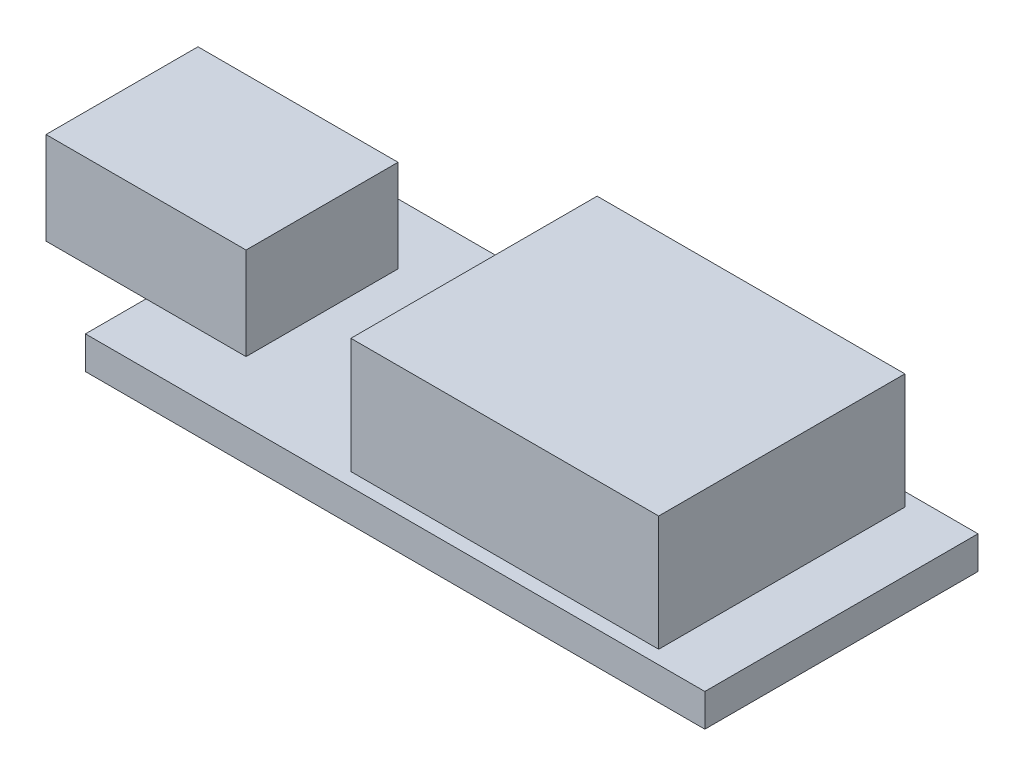
ISO-10303-21;
HEADER;
FILE_DESCRIPTION(('STEP AP214'),'2;1');
FILE_NAME('part.step','',(''),(''),'','','');
FILE_SCHEMA(('AUTOMOTIVE_DESIGN { 1 0 10303 214 1 1 1 1 }'));
ENDSEC;
DATA;
#1=APPLICATION_CONTEXT('core data for automotive mechanical design processes');
#2=APPLICATION_PROTOCOL_DEFINITION('international standard','automotive_design',2000,#1);
#3=PRODUCT_CONTEXT('',#1,'mechanical');
#4=PRODUCT('Part','Part','',(#3));
#5=PRODUCT_RELATED_PRODUCT_CATEGORY('part','',(#4));
#6=PRODUCT_DEFINITION_FORMATION('','',#4);
#7=PRODUCT_DEFINITION_CONTEXT('part definition',#1,'design');
#8=PRODUCT_DEFINITION('design','',#6,#7);
#9=PRODUCT_DEFINITION_SHAPE('','',#8);
#10=(LENGTH_UNIT() NAMED_UNIT(*) SI_UNIT(.MILLI.,.METRE.));
#11=(NAMED_UNIT(*) PLANE_ANGLE_UNIT() SI_UNIT($,.RADIAN.));
#12=(NAMED_UNIT(*) SI_UNIT($,.STERADIAN.) SOLID_ANGLE_UNIT());
#13=UNCERTAINTY_MEASURE_WITH_UNIT(LENGTH_MEASURE(1.E-05),#10,'distance_accuracy_value','');
#14=(GEOMETRIC_REPRESENTATION_CONTEXT(3) GLOBAL_UNCERTAINTY_ASSIGNED_CONTEXT((#13)) GLOBAL_UNIT_ASSIGNED_CONTEXT((#10,
#11,#12)) REPRESENTATION_CONTEXT('',''));
#15=CARTESIAN_POINT('',(0.,0.,0.));
#16=DIRECTION('',(0.,0.,1.));
#17=DIRECTION('',(1.,0.,0.));
#18=AXIS2_PLACEMENT_3D('',#15,#16,#17);
#19=CARTESIAN_POINT('',(0.,1.7,0.));
#20=DIRECTION('',(0.,1.,0.));
#21=DIRECTION('',(0.,0.,1.));
#22=AXIS2_PLACEMENT_3D('',#19,#20,#21);
#23=PLANE('',#22);
#24=DIRECTION('',(0.,0.,-1.));
#25=VECTOR('',#24,1.);
#26=CARTESIAN_POINT('',(13.,1.7,-6.4));
#27=LINE('',#26,#25);
#28=CARTESIAN_POINT('',(13.,1.7,6.4));
#29=VERTEX_POINT('',#28);
#30=CARTESIAN_POINT('',(13.,1.7,-6.4));
#31=VERTEX_POINT('',#30);
#32=EDGE_CURVE('E154',#29,#31,#27,.T.);
#33=ORIENTED_EDGE('',*,*,#32,.F.);
#34=DIRECTION('',(1.,0.,0.));
#35=VECTOR('',#34,1.);
#36=CARTESIAN_POINT('',(-3.,1.7,6.4));
#37=LINE('',#36,#35);
#38=CARTESIAN_POINT('',(-3.,1.7,6.4));
#39=VERTEX_POINT('',#38);
#40=EDGE_CURVE('E167',#39,#29,#37,.T.);
#41=ORIENTED_EDGE('',*,*,#40,.F.);
#42=DIRECTION('',(0.,0.,1.));
#43=VECTOR('',#42,1.);
#44=CARTESIAN_POINT('',(-3.,1.7,-6.4));
#45=LINE('',#44,#43);
#46=CARTESIAN_POINT('',(-3.,1.7,-6.4));
#47=VERTEX_POINT('',#46);
#48=EDGE_CURVE('E176',#47,#39,#45,.T.);
#49=ORIENTED_EDGE('',*,*,#48,.F.);
#50=DIRECTION('',(-1.,0.,0.));
#51=VECTOR('',#50,1.);
#52=CARTESIAN_POINT('',(-3.,1.7,-6.4));
#53=LINE('',#52,#51);
#54=EDGE_CURVE('E157',#31,#47,#53,.T.);
#55=ORIENTED_EDGE('',*,*,#54,.F.);
#56=EDGE_LOOP('',(#33,#41,#49,#55));
#57=FACE_BOUND('',#56,.T.);
#58=CARTESIAN_POINT('',(-5.95,1.7,0.));
#59=DIRECTION('',(0.,1.,0.));
#60=DIRECTION('',(0.,0.,1.));
#61=AXIS2_PLACEMENT_3D('',#58,#59,#60);
#62=CIRCLE('',#61,1.35);
#63=CARTESIAN_POINT('',(-5.95,1.7,1.35));
#64=VERTEX_POINT('',#63);
#65=EDGE_CURVE('E193',#64,#64,#62,.T.);
#66=ORIENTED_EDGE('',*,*,#65,.F.);
#67=EDGE_LOOP('',(#66));
#68=FACE_BOUND('',#67,.T.);
#69=DIRECTION('',(0.,0.,1.));
#70=VECTOR('',#69,1.);
#71=CARTESIAN_POINT('',(-16.1,1.7,-7.1));
#72=LINE('',#71,#70);
#73=CARTESIAN_POINT('',(-16.1,1.7,-7.1));
#74=VERTEX_POINT('',#73);
#75=CARTESIAN_POINT('',(-16.1,1.7,-3.95));
#76=VERTEX_POINT('',#75);
#77=EDGE_CURVE('E206',#74,#76,#72,.T.);
#78=ORIENTED_EDGE('',*,*,#77,.T.);
#79=DIRECTION('',(-1.,0.,0.));
#80=VECTOR('',#79,1.);
#81=CARTESIAN_POINT('',(-21.3,1.7,-3.95));
#82=LINE('',#81,#80);
#83=CARTESIAN_POINT('',(-10.9,1.7,-3.95));
#84=VERTEX_POINT('',#83);
#85=EDGE_CURVE('E52',#84,#76,#82,.T.);
#86=ORIENTED_EDGE('',*,*,#85,.F.);
#87=DIRECTION('',(0.,0.,-1.));
#88=VECTOR('',#87,1.);
#89=CARTESIAN_POINT('',(-10.9,1.7,-3.95));
#90=LINE('',#89,#88);
#91=CARTESIAN_POINT('',(-10.9,1.7,3.95));
#92=VERTEX_POINT('',#91);
#93=EDGE_CURVE('E57',#92,#84,#90,.T.);
#94=ORIENTED_EDGE('',*,*,#93,.F.);
#95=DIRECTION('',(1.,0.,0.));
#96=VECTOR('',#95,1.);
#97=CARTESIAN_POINT('',(-21.3,1.7,3.95));
#98=LINE('',#97,#96);
#99=CARTESIAN_POINT('',(-16.1,1.7,3.95));
#100=VERTEX_POINT('',#99);
#101=EDGE_CURVE('E243',#100,#92,#98,.T.);
#102=ORIENTED_EDGE('',*,*,#101,.F.);
#103=CARTESIAN_POINT('',(-16.1,1.7,7.1));
#104=VERTEX_POINT('',#103);
#105=EDGE_CURVE('E205',#100,#104,#72,.T.);
#106=ORIENTED_EDGE('',*,*,#105,.T.);
#107=DIRECTION('',(1.,0.,0.));
#108=VECTOR('',#107,1.);
#109=CARTESIAN_POINT('',(-16.1,1.7,7.1));
#110=LINE('',#109,#108);
#111=CARTESIAN_POINT('',(16.1,1.7,7.1));
#112=VERTEX_POINT('',#111);
#113=EDGE_CURVE('E208',#104,#112,#110,.T.);
#114=ORIENTED_EDGE('',*,*,#113,.T.);
#115=DIRECTION('',(0.,0.,-1.));
#116=VECTOR('',#115,1.);
#117=CARTESIAN_POINT('',(16.1,1.7,-7.1));
#118=LINE('',#117,#116);
#119=CARTESIAN_POINT('',(16.1,1.7,-7.1));
#120=VERTEX_POINT('',#119);
#121=EDGE_CURVE('E199',#112,#120,#118,.T.);
#122=ORIENTED_EDGE('',*,*,#121,.T.);
#123=DIRECTION('',(-1.,0.,0.));
#124=VECTOR('',#123,1.);
#125=CARTESIAN_POINT('',(-16.1,1.7,-7.1));
#126=LINE('',#125,#124);
#127=EDGE_CURVE('E202',#120,#74,#126,.T.);
#128=ORIENTED_EDGE('',*,*,#127,.T.);
#129=EDGE_LOOP('',(#78,#86,#94,#102,#106,#114,#122,#128));
#130=FACE_BOUND('',#129,.T.);
#131=ADVANCED_FACE('F37',(#57,#68,#130),#23,.T.);
#132=CARTESIAN_POINT('',(0.,0.,0.));
#133=DIRECTION('',(0.,1.,0.));
#134=DIRECTION('',(0.,0.,1.));
#135=AXIS2_PLACEMENT_3D('',#132,#133,#134);
#136=PLANE('',#135);
#137=DIRECTION('',(0.,0.,-1.));
#138=VECTOR('',#137,1.);
#139=CARTESIAN_POINT('',(16.1,0.,-7.1));
#140=LINE('',#139,#138);
#141=CARTESIAN_POINT('',(16.1,0.,7.1));
#142=VERTEX_POINT('',#141);
#143=CARTESIAN_POINT('',(16.1,0.,-7.1));
#144=VERTEX_POINT('',#143);
#145=EDGE_CURVE('E196',#142,#144,#140,.T.);
#146=ORIENTED_EDGE('',*,*,#145,.F.);
#147=DIRECTION('',(1.,0.,0.));
#148=VECTOR('',#147,1.);
#149=CARTESIAN_POINT('',(-16.1,0.,7.1));
#150=LINE('',#149,#148);
#151=CARTESIAN_POINT('',(-16.1,0.,7.1));
#152=VERTEX_POINT('',#151);
#153=EDGE_CURVE('E203',#152,#142,#150,.T.);
#154=ORIENTED_EDGE('',*,*,#153,.F.);
#155=DIRECTION('',(0.,0.,1.));
#156=VECTOR('',#155,1.);
#157=CARTESIAN_POINT('',(-16.1,0.,-7.1));
#158=LINE('',#157,#156);
#159=CARTESIAN_POINT('',(-16.1,0.,-7.1));
#160=VERTEX_POINT('',#159);
#161=EDGE_CURVE('E216',#160,#152,#158,.T.);
#162=ORIENTED_EDGE('',*,*,#161,.F.);
#163=DIRECTION('',(-1.,0.,0.));
#164=VECTOR('',#163,1.);
#165=CARTESIAN_POINT('',(-16.1,0.,-7.1));
#166=LINE('',#165,#164);
#167=EDGE_CURVE('E214',#144,#160,#166,.T.);
#168=ORIENTED_EDGE('',*,*,#167,.F.);
#169=EDGE_LOOP('',(#146,#154,#162,#168));
#170=FACE_BOUND('',#169,.T.);
#171=CARTESIAN_POINT('',(-5.95,0.,0.));
#172=DIRECTION('',(0.,1.,0.));
#173=DIRECTION('',(0.,0.,1.));
#174=AXIS2_PLACEMENT_3D('',#171,#172,#173);
#175=CIRCLE('',#174,1.35);
#176=CARTESIAN_POINT('',(-5.95,0.,1.35));
#177=VERTEX_POINT('',#176);
#178=EDGE_CURVE('E192',#177,#177,#175,.T.);
#179=ORIENTED_EDGE('',*,*,#178,.T.);
#180=EDGE_LOOP('',(#179));
#181=FACE_BOUND('',#180,.T.);
#182=ADVANCED_FACE('F234',(#170,#181),#136,.F.);
#183=CARTESIAN_POINT('',(16.1,1.7,-7.1));
#184=DIRECTION('',(-1.,0.,0.));
#185=DIRECTION('',(0.,0.,1.));
#186=AXIS2_PLACEMENT_3D('',#183,#184,#185);
#187=PLANE('',#186);
#188=ORIENTED_EDGE('',*,*,#145,.T.);
#189=DIRECTION('',(0.,-1.,0.));
#190=VECTOR('',#189,1.);
#191=CARTESIAN_POINT('',(16.1,1.7,-7.1));
#192=LINE('',#191,#190);
#193=EDGE_CURVE('E11',#120,#144,#192,.T.);
#194=ORIENTED_EDGE('',*,*,#193,.F.);
#195=ORIENTED_EDGE('',*,*,#121,.F.);
#196=DIRECTION('',(0.,-1.,0.));
#197=VECTOR('',#196,1.);
#198=CARTESIAN_POINT('',(16.1,1.7,7.1));
#199=LINE('',#198,#197);
#200=EDGE_CURVE('E211',#112,#142,#199,.T.);
#201=ORIENTED_EDGE('',*,*,#200,.T.);
#202=EDGE_LOOP('',(#188,#194,#195,#201));
#203=FACE_BOUND('',#202,.T.);
#204=ADVANCED_FACE('F39',(#203),#187,.F.);
#205=CARTESIAN_POINT('',(-16.1,1.7,-7.1));
#206=DIRECTION('',(0.,0.,1.));
#207=DIRECTION('',(1.,0.,0.));
#208=AXIS2_PLACEMENT_3D('',#205,#206,#207);
#209=PLANE('',#208);
#210=ORIENTED_EDGE('',*,*,#167,.T.);
#211=DIRECTION('',(0.,-1.,0.));
#212=VECTOR('',#211,1.);
#213=CARTESIAN_POINT('',(-16.1,1.7,-7.1));
#214=LINE('',#213,#212);
#215=EDGE_CURVE('E45',#74,#160,#214,.T.);
#216=ORIENTED_EDGE('',*,*,#215,.F.);
#217=ORIENTED_EDGE('',*,*,#127,.F.);
#218=ORIENTED_EDGE('',*,*,#193,.T.);
#219=EDGE_LOOP('',(#210,#216,#217,#218));
#220=FACE_BOUND('',#219,.T.);
#221=ADVANCED_FACE('F290',(#220),#209,.F.);
#222=CARTESIAN_POINT('',(-16.1,1.7,-7.1));
#223=DIRECTION('',(1.,0.,0.));
#224=DIRECTION('',(0.,0.,-1.));
#225=AXIS2_PLACEMENT_3D('',#222,#223,#224);
#226=PLANE('',#225);
#227=ORIENTED_EDGE('',*,*,#161,.T.);
#228=DIRECTION('',(0.,-1.,0.));
#229=VECTOR('',#228,1.);
#230=CARTESIAN_POINT('',(-16.1,1.7,7.1));
#231=LINE('',#230,#229);
#232=EDGE_CURVE('E221',#104,#152,#231,.T.);
#233=ORIENTED_EDGE('',*,*,#232,.F.);
#234=ORIENTED_EDGE('',*,*,#105,.F.);
#235=EDGE_CURVE('E209',#76,#100,#72,.T.);
#236=ORIENTED_EDGE('',*,*,#235,.F.);
#237=ORIENTED_EDGE('',*,*,#77,.F.);
#238=ORIENTED_EDGE('',*,*,#215,.T.);
#239=EDGE_LOOP('',(#227,#233,#234,#236,#237,#238));
#240=FACE_BOUND('',#239,.T.);
#241=ADVANCED_FACE('F228',(#240),#226,.F.);
#242=CARTESIAN_POINT('',(-16.1,1.7,7.1));
#243=DIRECTION('',(0.,0.,-1.));
#244=DIRECTION('',(-1.,0.,0.));
#245=AXIS2_PLACEMENT_3D('',#242,#243,#244);
#246=PLANE('',#245);
#247=ORIENTED_EDGE('',*,*,#153,.T.);
#248=ORIENTED_EDGE('',*,*,#200,.F.);
#249=ORIENTED_EDGE('',*,*,#113,.F.);
#250=ORIENTED_EDGE('',*,*,#232,.T.);
#251=EDGE_LOOP('',(#247,#248,#249,#250));
#252=FACE_BOUND('',#251,.T.);
#253=ADVANCED_FACE('F238',(#252),#246,.F.);
#254=CARTESIAN_POINT('',(-5.95,1.7,0.));
#255=DIRECTION('',(0.,-1.,0.));
#256=DIRECTION('',(0.,0.,-1.));
#257=AXIS2_PLACEMENT_3D('',#254,#255,#256);
#258=CYLINDRICAL_SURFACE('',#257,1.35);
#259=ORIENTED_EDGE('',*,*,#65,.T.);
#260=EDGE_LOOP('',(#259));
#261=FACE_BOUND('',#260,.T.);
#262=ORIENTED_EDGE('',*,*,#178,.F.);
#263=EDGE_LOOP('',(#262));
#264=FACE_BOUND('',#263,.T.);
#265=ADVANCED_FACE('F284',(#261,#264),#258,.F.);
#266=CARTESIAN_POINT('',(13.,7.7,-6.4));
#267=DIRECTION('',(-1.,0.,0.));
#268=DIRECTION('',(0.,0.,1.));
#269=AXIS2_PLACEMENT_3D('',#266,#267,#268);
#270=PLANE('',#269);
#271=ORIENTED_EDGE('',*,*,#32,.T.);
#272=DIRECTION('',(0.,-1.,0.));
#273=VECTOR('',#272,1.);
#274=CARTESIAN_POINT('',(13.,7.7,-6.4));
#275=LINE('',#274,#273);
#276=CARTESIAN_POINT('',(13.,7.7,-6.4));
#277=VERTEX_POINT('',#276);
#278=EDGE_CURVE('E189',#277,#31,#275,.T.);
#279=ORIENTED_EDGE('',*,*,#278,.F.);
#280=DIRECTION('',(0.,0.,-1.));
#281=VECTOR('',#280,1.);
#282=CARTESIAN_POINT('',(13.,7.7,-6.4));
#283=LINE('',#282,#281);
#284=CARTESIAN_POINT('',(13.,7.7,6.4));
#285=VERTEX_POINT('',#284);
#286=EDGE_CURVE('E163',#285,#277,#283,.T.);
#287=ORIENTED_EDGE('',*,*,#286,.F.);
#288=DIRECTION('',(0.,-1.,0.));
#289=VECTOR('',#288,1.);
#290=CARTESIAN_POINT('',(13.,7.7,6.4));
#291=LINE('',#290,#289);
#292=EDGE_CURVE('E172',#285,#29,#291,.T.);
#293=ORIENTED_EDGE('',*,*,#292,.T.);
#294=EDGE_LOOP('',(#271,#279,#287,#293));
#295=FACE_BOUND('',#294,.T.);
#296=ADVANCED_FACE('F339',(#295),#270,.F.);
#297=CARTESIAN_POINT('',(-3.,7.7,-6.4));
#298=DIRECTION('',(0.,0.,1.));
#299=DIRECTION('',(1.,0.,0.));
#300=AXIS2_PLACEMENT_3D('',#297,#298,#299);
#301=PLANE('',#300);
#302=ORIENTED_EDGE('',*,*,#54,.T.);
#303=DIRECTION('',(0.,-1.,0.));
#304=VECTOR('',#303,1.);
#305=CARTESIAN_POINT('',(-3.,7.7,-6.4));
#306=LINE('',#305,#304);
#307=CARTESIAN_POINT('',(-3.,7.7,-6.4));
#308=VERTEX_POINT('',#307);
#309=EDGE_CURVE('E186',#308,#47,#306,.T.);
#310=ORIENTED_EDGE('',*,*,#309,.F.);
#311=DIRECTION('',(-1.,0.,0.));
#312=VECTOR('',#311,1.);
#313=CARTESIAN_POINT('',(-3.,7.7,-6.4));
#314=LINE('',#313,#312);
#315=EDGE_CURVE('E166',#277,#308,#314,.T.);
#316=ORIENTED_EDGE('',*,*,#315,.F.);
#317=ORIENTED_EDGE('',*,*,#278,.T.);
#318=EDGE_LOOP('',(#302,#310,#316,#317));
#319=FACE_BOUND('',#318,.T.);
#320=ADVANCED_FACE('F349',(#319),#301,.F.);
#321=CARTESIAN_POINT('',(-3.,7.7,-6.4));
#322=DIRECTION('',(1.,0.,0.));
#323=DIRECTION('',(0.,0.,-1.));
#324=AXIS2_PLACEMENT_3D('',#321,#322,#323);
#325=PLANE('',#324);
#326=ORIENTED_EDGE('',*,*,#48,.T.);
#327=DIRECTION('',(0.,-1.,0.));
#328=VECTOR('',#327,1.);
#329=CARTESIAN_POINT('',(-3.,7.7,6.4));
#330=LINE('',#329,#328);
#331=CARTESIAN_POINT('',(-3.,7.7,6.4));
#332=VERTEX_POINT('',#331);
#333=EDGE_CURVE('E183',#332,#39,#330,.T.);
#334=ORIENTED_EDGE('',*,*,#333,.F.);
#335=DIRECTION('',(0.,0.,1.));
#336=VECTOR('',#335,1.);
#337=CARTESIAN_POINT('',(-3.,7.7,-6.4));
#338=LINE('',#337,#336);
#339=EDGE_CURVE('E169',#308,#332,#338,.T.);
#340=ORIENTED_EDGE('',*,*,#339,.F.);
#341=ORIENTED_EDGE('',*,*,#309,.T.);
#342=EDGE_LOOP('',(#326,#334,#340,#341));
#343=FACE_BOUND('',#342,.T.);
#344=ADVANCED_FACE('F359',(#343),#325,.F.);
#345=CARTESIAN_POINT('',(-3.,7.7,6.4));
#346=DIRECTION('',(0.,0.,-1.));
#347=DIRECTION('',(-1.,0.,0.));
#348=AXIS2_PLACEMENT_3D('',#345,#346,#347);
#349=PLANE('',#348);
#350=ORIENTED_EDGE('',*,*,#40,.T.);
#351=ORIENTED_EDGE('',*,*,#292,.F.);
#352=DIRECTION('',(1.,0.,0.));
#353=VECTOR('',#352,1.);
#354=CARTESIAN_POINT('',(-3.,7.7,6.4));
#355=LINE('',#354,#353);
#356=EDGE_CURVE('E171',#332,#285,#355,.T.);
#357=ORIENTED_EDGE('',*,*,#356,.F.);
#358=ORIENTED_EDGE('',*,*,#333,.T.);
#359=EDGE_LOOP('',(#350,#351,#357,#358));
#360=FACE_BOUND('',#359,.T.);
#361=ADVANCED_FACE('F370',(#360),#349,.F.);
#362=CARTESIAN_POINT('',(0.,7.7,0.));
#363=DIRECTION('',(0.,1.,0.));
#364=DIRECTION('',(0.,0.,1.));
#365=AXIS2_PLACEMENT_3D('',#362,#363,#364);
#366=PLANE('',#365);
#367=ORIENTED_EDGE('',*,*,#286,.T.);
#368=ORIENTED_EDGE('',*,*,#315,.T.);
#369=ORIENTED_EDGE('',*,*,#339,.T.);
#370=ORIENTED_EDGE('',*,*,#356,.T.);
#371=EDGE_LOOP('',(#367,#368,#369,#370));
#372=FACE_BOUND('',#371,.T.);
#373=ADVANCED_FACE('F381',(#372),#366,.T.);
#374=CARTESIAN_POINT('',(0.,1.7,0.));
#375=DIRECTION('',(0.,1.,0.));
#376=DIRECTION('',(0.,0.,1.));
#377=AXIS2_PLACEMENT_3D('',#374,#375,#376);
#378=PLANE('',#377);
#379=CARTESIAN_POINT('',(-21.3,1.7,-3.95));
#380=VERTEX_POINT('',#379);
#381=EDGE_CURVE('E251',#76,#380,#82,.T.);
#382=ORIENTED_EDGE('',*,*,#381,.F.);
#383=ORIENTED_EDGE('',*,*,#235,.T.);
#384=CARTESIAN_POINT('',(-21.3,1.7,3.95));
#385=VERTEX_POINT('',#384);
#386=EDGE_CURVE('E151',#385,#100,#98,.T.);
#387=ORIENTED_EDGE('',*,*,#386,.F.);
#388=DIRECTION('',(0.,0.,1.));
#389=VECTOR('',#388,1.);
#390=CARTESIAN_POINT('',(-21.3,1.7,-3.95));
#391=LINE('',#390,#389);
#392=EDGE_CURVE('E257',#380,#385,#391,.T.);
#393=ORIENTED_EDGE('',*,*,#392,.F.);
#394=EDGE_LOOP('',(#382,#383,#387,#393));
#395=FACE_BOUND('',#394,.T.);
#396=ADVANCED_FACE('F249',(#395),#378,.F.);
#397=CARTESIAN_POINT('',(-10.9,6.5,-3.95));
#398=DIRECTION('',(-1.,0.,0.));
#399=DIRECTION('',(0.,0.,1.));
#400=AXIS2_PLACEMENT_3D('',#397,#398,#399);
#401=PLANE('',#400);
#402=ORIENTED_EDGE('',*,*,#93,.T.);
#403=DIRECTION('',(0.,-1.,0.));
#404=VECTOR('',#403,1.);
#405=CARTESIAN_POINT('',(-10.9,6.5,-3.95));
#406=LINE('',#405,#404);
#407=CARTESIAN_POINT('',(-10.9,6.5,-3.95));
#408=VERTEX_POINT('',#407);
#409=EDGE_CURVE('E136',#408,#84,#406,.T.);
#410=ORIENTED_EDGE('',*,*,#409,.F.);
#411=DIRECTION('',(0.,0.,-1.));
#412=VECTOR('',#411,1.);
#413=CARTESIAN_POINT('',(-10.9,6.5,-3.95));
#414=LINE('',#413,#412);
#415=CARTESIAN_POINT('',(-10.9,6.5,3.95));
#416=VERTEX_POINT('',#415);
#417=EDGE_CURVE('E142',#416,#408,#414,.T.);
#418=ORIENTED_EDGE('',*,*,#417,.F.);
#419=DIRECTION('',(0.,-1.,0.));
#420=VECTOR('',#419,1.);
#421=CARTESIAN_POINT('',(-10.9,6.5,3.95));
#422=LINE('',#421,#420);
#423=EDGE_CURVE('E261',#416,#92,#422,.T.);
#424=ORIENTED_EDGE('',*,*,#423,.T.);
#425=EDGE_LOOP('',(#402,#410,#418,#424));
#426=FACE_BOUND('',#425,.T.);
#427=ADVANCED_FACE('F153',(#426),#401,.F.);
#428=CARTESIAN_POINT('',(-21.3,6.5,-3.95));
#429=DIRECTION('',(0.,0.,1.));
#430=DIRECTION('',(1.,0.,0.));
#431=AXIS2_PLACEMENT_3D('',#428,#429,#430);
#432=PLANE('',#431);
#433=ORIENTED_EDGE('',*,*,#85,.T.);
#434=ORIENTED_EDGE('',*,*,#381,.T.);
#435=DIRECTION('',(0.,-1.,0.));
#436=VECTOR('',#435,1.);
#437=CARTESIAN_POINT('',(-21.3,6.5,-3.95));
#438=LINE('',#437,#436);
#439=CARTESIAN_POINT('',(-21.3,6.5,-3.95));
#440=VERTEX_POINT('',#439);
#441=EDGE_CURVE('E138',#440,#380,#438,.T.);
#442=ORIENTED_EDGE('',*,*,#441,.F.);
#443=DIRECTION('',(-1.,0.,0.));
#444=VECTOR('',#443,1.);
#445=CARTESIAN_POINT('',(-21.3,6.5,-3.95));
#446=LINE('',#445,#444);
#447=EDGE_CURVE('E132',#408,#440,#446,.T.);
#448=ORIENTED_EDGE('',*,*,#447,.F.);
#449=ORIENTED_EDGE('',*,*,#409,.T.);
#450=EDGE_LOOP('',(#433,#434,#442,#448,#449));
#451=FACE_BOUND('',#450,.T.);
#452=ADVANCED_FACE('F134',(#451),#432,.F.);
#453=CARTESIAN_POINT('',(-21.3,6.5,-3.95));
#454=DIRECTION('',(1.,0.,0.));
#455=DIRECTION('',(0.,0.,-1.));
#456=AXIS2_PLACEMENT_3D('',#453,#454,#455);
#457=PLANE('',#456);
#458=ORIENTED_EDGE('',*,*,#392,.T.);
#459=DIRECTION('',(0.,-1.,0.));
#460=VECTOR('',#459,1.);
#461=CARTESIAN_POINT('',(-21.3,6.5,3.95));
#462=LINE('',#461,#460);
#463=CARTESIAN_POINT('',(-21.3,6.5,3.95));
#464=VERTEX_POINT('',#463);
#465=EDGE_CURVE('E159',#464,#385,#462,.T.);
#466=ORIENTED_EDGE('',*,*,#465,.F.);
#467=DIRECTION('',(0.,0.,1.));
#468=VECTOR('',#467,1.);
#469=CARTESIAN_POINT('',(-21.3,6.5,-3.95));
#470=LINE('',#469,#468);
#471=EDGE_CURVE('E141',#440,#464,#470,.T.);
#472=ORIENTED_EDGE('',*,*,#471,.F.);
#473=ORIENTED_EDGE('',*,*,#441,.T.);
#474=EDGE_LOOP('',(#458,#466,#472,#473));
#475=FACE_BOUND('',#474,.T.);
#476=ADVANCED_FACE('F266',(#475),#457,.F.);
#477=CARTESIAN_POINT('',(-21.3,6.5,3.95));
#478=DIRECTION('',(0.,0.,-1.));
#479=DIRECTION('',(-1.,0.,0.));
#480=AXIS2_PLACEMENT_3D('',#477,#478,#479);
#481=PLANE('',#480);
#482=ORIENTED_EDGE('',*,*,#386,.T.);
#483=ORIENTED_EDGE('',*,*,#101,.T.);
#484=ORIENTED_EDGE('',*,*,#423,.F.);
#485=DIRECTION('',(1.,0.,0.));
#486=VECTOR('',#485,1.);
#487=CARTESIAN_POINT('',(-21.3,6.5,3.95));
#488=LINE('',#487,#486);
#489=EDGE_CURVE('E147',#464,#416,#488,.T.);
#490=ORIENTED_EDGE('',*,*,#489,.F.);
#491=ORIENTED_EDGE('',*,*,#465,.T.);
#492=EDGE_LOOP('',(#482,#483,#484,#490,#491));
#493=FACE_BOUND('',#492,.T.);
#494=ADVANCED_FACE('F254',(#493),#481,.F.);
#495=CARTESIAN_POINT('',(0.,6.5,0.));
#496=DIRECTION('',(0.,1.,0.));
#497=DIRECTION('',(0.,0.,1.));
#498=AXIS2_PLACEMENT_3D('',#495,#496,#497);
#499=PLANE('',#498);
#500=ORIENTED_EDGE('',*,*,#417,.T.);
#501=ORIENTED_EDGE('',*,*,#447,.T.);
#502=ORIENTED_EDGE('',*,*,#471,.T.);
#503=ORIENTED_EDGE('',*,*,#489,.T.);
#504=EDGE_LOOP('',(#500,#501,#502,#503));
#505=FACE_BOUND('',#504,.T.);
#506=ADVANCED_FACE('F145',(#505),#499,.T.);
#507=CLOSED_SHELL('',(#131,#182,#204,#221,#241,#253,#265,#296,#320,#344,#361,#373,#396,#427,
#452,#476,#494,#506));
#508=MANIFOLD_SOLID_BREP('B2',#507);
#509=ADVANCED_BREP_SHAPE_REPRESENTATION('',(#18,#508),#14);
#510=SHAPE_DEFINITION_REPRESENTATION(#9,#509);
ENDSEC;
END-ISO-10303-21;
